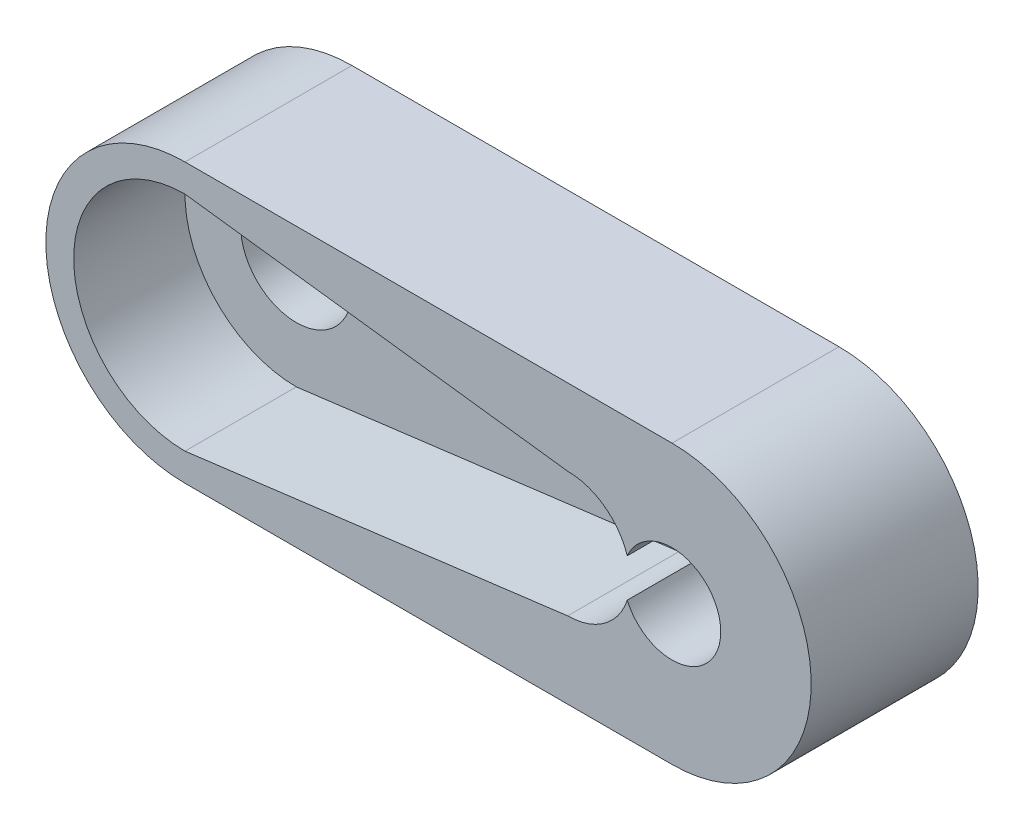
ISO-10303-21;
HEADER;
FILE_DESCRIPTION(('STEP AP214'),'2;1');
FILE_NAME('part.step','',(''),(''),'','','');
FILE_SCHEMA(('AUTOMOTIVE_DESIGN { 1 0 10303 214 1 1 1 1 }'));
ENDSEC;
DATA;
#1=APPLICATION_CONTEXT('core data for automotive mechanical design processes');
#2=APPLICATION_PROTOCOL_DEFINITION('international standard','automotive_design',2000,#1);
#3=PRODUCT_CONTEXT('',#1,'mechanical');
#4=PRODUCT('Part','Part','',(#3));
#5=PRODUCT_RELATED_PRODUCT_CATEGORY('part','',(#4));
#6=PRODUCT_DEFINITION_FORMATION('','',#4);
#7=PRODUCT_DEFINITION_CONTEXT('part definition',#1,'design');
#8=PRODUCT_DEFINITION('design','',#6,#7);
#9=PRODUCT_DEFINITION_SHAPE('','',#8);
#10=(LENGTH_UNIT() NAMED_UNIT(*) SI_UNIT(.MILLI.,.METRE.));
#11=(NAMED_UNIT(*) PLANE_ANGLE_UNIT() SI_UNIT($,.RADIAN.));
#12=(NAMED_UNIT(*) SI_UNIT($,.STERADIAN.) SOLID_ANGLE_UNIT());
#13=UNCERTAINTY_MEASURE_WITH_UNIT(LENGTH_MEASURE(1.E-05),#10,'distance_accuracy_value','');
#14=(GEOMETRIC_REPRESENTATION_CONTEXT(3) GLOBAL_UNCERTAINTY_ASSIGNED_CONTEXT((#13)) GLOBAL_UNIT_ASSIGNED_CONTEXT((#10,
#11,#12)) REPRESENTATION_CONTEXT('',''));
#15=CARTESIAN_POINT('',(0.,0.,0.));
#16=DIRECTION('',(0.,0.,1.));
#17=DIRECTION('',(1.,0.,0.));
#18=AXIS2_PLACEMENT_3D('',#15,#16,#17);
#19=CARTESIAN_POINT('',(0.,5.,6.));
#20=DIRECTION('',(0.,0.,-1.));
#21=DIRECTION('',(-1.,0.,0.));
#22=AXIS2_PLACEMENT_3D('',#19,#20,#21);
#23=CYLINDRICAL_SURFACE('',#22,2.);
#24=CARTESIAN_POINT('',(0.,5.,0.));
#25=DIRECTION('',(0.,0.,1.));
#26=DIRECTION('',(1.,0.,0.));
#27=AXIS2_PLACEMENT_3D('',#24,#25,#26);
#28=CIRCLE('',#27,2.);
#29=CARTESIAN_POINT('',(2.,5.,0.));
#30=VERTEX_POINT('',#29);
#31=EDGE_CURVE('E165',#30,#30,#28,.T.);
#32=ORIENTED_EDGE('',*,*,#31,.F.);
#33=EDGE_LOOP('',(#32));
#34=FACE_BOUND('',#33,.T.);
#35=CARTESIAN_POINT('',(0.,5.,2.));
#36=DIRECTION('',(0.,0.,1.));
#37=DIRECTION('',(1.,0.,0.));
#38=AXIS2_PLACEMENT_3D('',#35,#36,#37);
#39=CIRCLE('',#38,2.);
#40=CARTESIAN_POINT('',(2.,5.,2.));
#41=VERTEX_POINT('',#40);
#42=EDGE_CURVE('E148',#41,#41,#39,.F.);
#43=ORIENTED_EDGE('',*,*,#42,.F.);
#44=EDGE_LOOP('',(#43));
#45=FACE_BOUND('',#44,.T.);
#46=ADVANCED_FACE('F40',(#34,#45),#23,.F.);
#47=CARTESIAN_POINT('',(0.,5.,6.));
#48=DIRECTION('',(0.,0.,1.));
#49=DIRECTION('',(1.,0.,0.));
#50=AXIS2_PLACEMENT_3D('',#47,#48,#49);
#51=PLANE('',#50);
#52=CARTESIAN_POINT('',(13.75,5.,6.));
#53=DIRECTION('',(0.,0.,1.));
#54=DIRECTION('',(1.,0.,0.));
#55=AXIS2_PLACEMENT_3D('',#52,#53,#54);
#56=CIRCLE('',#55,2.25);
#57=CARTESIAN_POINT('',(13.75,2.75,6.));
#58=VERTEX_POINT('',#57);
#59=CARTESIAN_POINT('',(15.8916666666667,4.31024360177749,6.));
#60=VERTEX_POINT('',#59);
#61=EDGE_CURVE('E374',#58,#60,#56,.T.);
#62=ORIENTED_EDGE('',*,*,#61,.F.);
#63=DIRECTION('',(0.991997911723619,0.126254279673915,0.));
#64=VECTOR('',#63,1.);
#65=CARTESIAN_POINT('',(-0.125243981782694,0.984059856864021,6.));
#66=LINE('',#65,#64);
#67=CARTESIAN_POINT('',(0.,1.,6.));
#68=VERTEX_POINT('',#67);
#69=EDGE_CURVE('E370',#68,#58,#66,.T.);
#70=ORIENTED_EDGE('',*,*,#69,.F.);
#71=CARTESIAN_POINT('',(0.,5.,6.));
#72=DIRECTION('',(0.,0.,1.));
#73=DIRECTION('',(1.,0.,0.));
#74=AXIS2_PLACEMENT_3D('',#71,#72,#73);
#75=CIRCLE('',#74,4.);
#76=CARTESIAN_POINT('',(0.,9.,6.));
#77=VERTEX_POINT('',#76);
#78=EDGE_CURVE('E363',#77,#68,#75,.T.);
#79=ORIENTED_EDGE('',*,*,#78,.F.);
#80=DIRECTION('',(0.991997911723619,-0.126254279673915,0.));
#81=VECTOR('',#80,1.);
#82=CARTESIAN_POINT('',(1.12719583604424,8.85653871177619,6.));
#83=LINE('',#82,#81);
#84=CARTESIAN_POINT('',(13.75,7.25,6.));
#85=VERTEX_POINT('',#84);
#86=EDGE_CURVE('E360',#77,#85,#83,.T.);
#87=ORIENTED_EDGE('',*,*,#86,.T.);
#88=CARTESIAN_POINT('',(15.8916666666667,5.68975639822251,6.));
#89=VERTEX_POINT('',#88);
#90=EDGE_CURVE('E364',#89,#85,#56,.T.);
#91=ORIENTED_EDGE('',*,*,#90,.F.);
#92=CARTESIAN_POINT('',(17.5,5.,6.));
#93=DIRECTION('',(0.,0.,1.));
#94=DIRECTION('',(1.,0.,0.));
#95=AXIS2_PLACEMENT_3D('',#92,#93,#94);
#96=CIRCLE('',#95,1.75);
#97=EDGE_CURVE('E153',#60,#89,#96,.T.);
#98=ORIENTED_EDGE('',*,*,#97,.F.);
#99=EDGE_LOOP('',(#62,#70,#79,#87,#91,#98));
#100=FACE_BOUND('',#99,.T.);
#101=CARTESIAN_POINT('',(0.,5.,6.));
#102=DIRECTION('',(0.,0.,1.));
#103=DIRECTION('',(1.,0.,0.));
#104=AXIS2_PLACEMENT_3D('',#101,#102,#103);
#105=CIRCLE('',#104,5.);
#106=CARTESIAN_POINT('',(0.,10.,6.));
#107=VERTEX_POINT('',#106);
#108=CARTESIAN_POINT('',(0.,0.,6.));
#109=VERTEX_POINT('',#108);
#110=EDGE_CURVE('E171',#107,#109,#105,.T.);
#111=ORIENTED_EDGE('',*,*,#110,.T.);
#112=DIRECTION('',(1.,0.,0.));
#113=VECTOR('',#112,1.);
#114=CARTESIAN_POINT('',(0.,0.,6.));
#115=LINE('',#114,#113);
#116=CARTESIAN_POINT('',(17.5,0.,6.));
#117=VERTEX_POINT('',#116);
#118=EDGE_CURVE('E95',#109,#117,#115,.T.);
#119=ORIENTED_EDGE('',*,*,#118,.T.);
#120=CARTESIAN_POINT('',(17.5,5.,6.));
#121=DIRECTION('',(0.,0.,1.));
#122=DIRECTION('',(-1.,0.,0.));
#123=AXIS2_PLACEMENT_3D('',#120,#121,#122);
#124=CIRCLE('',#123,5.);
#125=CARTESIAN_POINT('',(17.5,10.,6.));
#126=VERTEX_POINT('',#125);
#127=EDGE_CURVE('E176',#117,#126,#124,.T.);
#128=ORIENTED_EDGE('',*,*,#127,.T.);
#129=DIRECTION('',(-1.,0.,0.));
#130=VECTOR('',#129,1.);
#131=CARTESIAN_POINT('',(0.,10.,6.));
#132=LINE('',#131,#130);
#133=EDGE_CURVE('E66',#126,#107,#132,.T.);
#134=ORIENTED_EDGE('',*,*,#133,.T.);
#135=EDGE_LOOP('',(#111,#119,#128,#134));
#136=FACE_BOUND('',#135,.T.);
#137=ADVANCED_FACE('F220',(#100,#136),#51,.T.);
#138=CARTESIAN_POINT('',(0.,5.,0.));
#139=DIRECTION('',(0.,0.,1.));
#140=DIRECTION('',(1.,0.,0.));
#141=AXIS2_PLACEMENT_3D('',#138,#139,#140);
#142=PLANE('',#141);
#143=CARTESIAN_POINT('',(17.5,5.,0.));
#144=DIRECTION('',(0.,0.,1.));
#145=DIRECTION('',(1.,0.,0.));
#146=AXIS2_PLACEMENT_3D('',#143,#144,#145);
#147=CIRCLE('',#146,3.00000000000001);
#148=CARTESIAN_POINT('',(14.5,5.,0.));
#149=VERTEX_POINT('',#148);
#150=EDGE_CURVE('E50',#149,#149,#147,.T.);
#151=ORIENTED_EDGE('',*,*,#150,.T.);
#152=EDGE_LOOP('',(#151));
#153=FACE_BOUND('',#152,.T.);
#154=CARTESIAN_POINT('',(0.,5.,0.));
#155=DIRECTION('',(0.,0.,1.));
#156=DIRECTION('',(1.,0.,0.));
#157=AXIS2_PLACEMENT_3D('',#154,#155,#156);
#158=CIRCLE('',#157,5.);
#159=CARTESIAN_POINT('',(0.,10.,0.));
#160=VERTEX_POINT('',#159);
#161=CARTESIAN_POINT('',(0.,0.,0.));
#162=VERTEX_POINT('',#161);
#163=EDGE_CURVE('E170',#160,#162,#158,.T.);
#164=ORIENTED_EDGE('',*,*,#163,.F.);
#165=DIRECTION('',(-1.,0.,0.));
#166=VECTOR('',#165,1.);
#167=CARTESIAN_POINT('',(0.,10.,0.));
#168=LINE('',#167,#166);
#169=CARTESIAN_POINT('',(17.5,10.,0.));
#170=VERTEX_POINT('',#169);
#171=EDGE_CURVE('E87',#170,#160,#168,.T.);
#172=ORIENTED_EDGE('',*,*,#171,.F.);
#173=CARTESIAN_POINT('',(17.5,5.,0.));
#174=DIRECTION('',(0.,0.,1.));
#175=DIRECTION('',(-1.,0.,0.));
#176=AXIS2_PLACEMENT_3D('',#173,#174,#175);
#177=CIRCLE('',#176,5.);
#178=CARTESIAN_POINT('',(17.5,0.,0.));
#179=VERTEX_POINT('',#178);
#180=EDGE_CURVE('E188',#179,#170,#177,.T.);
#181=ORIENTED_EDGE('',*,*,#180,.F.);
#182=DIRECTION('',(1.,0.,0.));
#183=VECTOR('',#182,1.);
#184=CARTESIAN_POINT('',(0.,0.,0.));
#185=LINE('',#184,#183);
#186=EDGE_CURVE('E185',#162,#179,#185,.T.);
#187=ORIENTED_EDGE('',*,*,#186,.F.);
#188=EDGE_LOOP('',(#164,#172,#181,#187));
#189=FACE_BOUND('',#188,.T.);
#190=ORIENTED_EDGE('',*,*,#31,.T.);
#191=EDGE_LOOP('',(#190));
#192=FACE_BOUND('',#191,.T.);
#193=ADVANCED_FACE('F208',(#153,#189,#192),#142,.F.);
#194=CARTESIAN_POINT('',(0.,5.,6.));
#195=DIRECTION('',(0.,0.,-1.));
#196=DIRECTION('',(-1.,0.,0.));
#197=AXIS2_PLACEMENT_3D('',#194,#195,#196);
#198=CYLINDRICAL_SURFACE('',#197,5.);
#199=ORIENTED_EDGE('',*,*,#163,.T.);
#200=DIRECTION('',(0.,0.,-1.));
#201=VECTOR('',#200,1.);
#202=CARTESIAN_POINT('',(0.,0.,6.));
#203=LINE('',#202,#201);
#204=EDGE_CURVE('E202',#109,#162,#203,.T.);
#205=ORIENTED_EDGE('',*,*,#204,.F.);
#206=ORIENTED_EDGE('',*,*,#110,.F.);
#207=DIRECTION('',(0.,0.,-1.));
#208=VECTOR('',#207,1.);
#209=CARTESIAN_POINT('',(0.,10.,6.));
#210=LINE('',#209,#208);
#211=EDGE_CURVE('E181',#107,#160,#210,.T.);
#212=ORIENTED_EDGE('',*,*,#211,.T.);
#213=EDGE_LOOP('',(#199,#205,#206,#212));
#214=FACE_BOUND('',#213,.T.);
#215=ADVANCED_FACE('F235',(#214),#198,.T.);
#216=CARTESIAN_POINT('',(0.,0.,6.));
#217=DIRECTION('',(0.,1.,0.));
#218=DIRECTION('',(0.,0.,1.));
#219=AXIS2_PLACEMENT_3D('',#216,#217,#218);
#220=PLANE('',#219);
#221=ORIENTED_EDGE('',*,*,#186,.T.);
#222=DIRECTION('',(0.,0.,-1.));
#223=VECTOR('',#222,1.);
#224=CARTESIAN_POINT('',(17.5,0.,6.));
#225=LINE('',#224,#223);
#226=EDGE_CURVE('E198',#117,#179,#225,.T.);
#227=ORIENTED_EDGE('',*,*,#226,.F.);
#228=ORIENTED_EDGE('',*,*,#118,.F.);
#229=ORIENTED_EDGE('',*,*,#204,.T.);
#230=EDGE_LOOP('',(#221,#227,#228,#229));
#231=FACE_BOUND('',#230,.T.);
#232=ADVANCED_FACE('F242',(#231),#220,.F.);
#233=CARTESIAN_POINT('',(17.5,5.,6.));
#234=DIRECTION('',(0.,0.,-1.));
#235=DIRECTION('',(-1.,0.,0.));
#236=AXIS2_PLACEMENT_3D('',#233,#234,#235);
#237=CYLINDRICAL_SURFACE('',#236,5.);
#238=ORIENTED_EDGE('',*,*,#180,.T.);
#239=DIRECTION('',(0.,0.,-1.));
#240=VECTOR('',#239,1.);
#241=CARTESIAN_POINT('',(17.5,10.,6.));
#242=LINE('',#241,#240);
#243=EDGE_CURVE('E195',#126,#170,#242,.T.);
#244=ORIENTED_EDGE('',*,*,#243,.F.);
#245=ORIENTED_EDGE('',*,*,#127,.F.);
#246=ORIENTED_EDGE('',*,*,#226,.T.);
#247=EDGE_LOOP('',(#238,#244,#245,#246));
#248=FACE_BOUND('',#247,.T.);
#249=ADVANCED_FACE('F239',(#248),#237,.T.);
#250=CARTESIAN_POINT('',(0.,10.,6.));
#251=DIRECTION('',(0.,-1.,0.));
#252=DIRECTION('',(0.,0.,-1.));
#253=AXIS2_PLACEMENT_3D('',#250,#251,#252);
#254=PLANE('',#253);
#255=ORIENTED_EDGE('',*,*,#171,.T.);
#256=ORIENTED_EDGE('',*,*,#211,.F.);
#257=ORIENTED_EDGE('',*,*,#133,.F.);
#258=ORIENTED_EDGE('',*,*,#243,.T.);
#259=EDGE_LOOP('',(#255,#256,#257,#258));
#260=FACE_BOUND('',#259,.T.);
#261=ADVANCED_FACE('F236',(#260),#254,.F.);
#262=CARTESIAN_POINT('',(17.5,5.,6.));
#263=DIRECTION('',(0.,0.,-1.));
#264=DIRECTION('',(-1.,0.,0.));
#265=AXIS2_PLACEMENT_3D('',#262,#263,#264);
#266=CYLINDRICAL_SURFACE('',#265,1.75);
#267=CARTESIAN_POINT('',(17.5,5.,1.25000000000001));
#268=DIRECTION('',(0.,0.,1.));
#269=DIRECTION('',(1.,0.,0.));
#270=AXIS2_PLACEMENT_3D('',#267,#268,#269);
#271=CIRCLE('',#270,1.75);
#272=CARTESIAN_POINT('',(15.75,5.,1.25000000000001));
#273=VERTEX_POINT('',#272);
#274=EDGE_CURVE('E11',#273,#273,#271,.F.);
#275=ORIENTED_EDGE('',*,*,#274,.T.);
#276=EDGE_LOOP('',(#275));
#277=FACE_BOUND('',#276,.T.);
#278=DIRECTION('',(0.,0.,1.));
#279=VECTOR('',#278,1.);
#280=CARTESIAN_POINT('',(15.8916666666667,4.31024360177749,2.));
#281=LINE('',#280,#279);
#282=CARTESIAN_POINT('',(15.8916666666667,4.31024360177749,2.));
#283=VERTEX_POINT('',#282);
#284=EDGE_CURVE('E166',#283,#60,#281,.T.);
#285=ORIENTED_EDGE('',*,*,#284,.T.);
#286=ORIENTED_EDGE('',*,*,#97,.T.);
#287=DIRECTION('',(0.,0.,1.));
#288=VECTOR('',#287,1.);
#289=CARTESIAN_POINT('',(15.8916666666667,5.68975639822251,2.));
#290=LINE('',#289,#288);
#291=CARTESIAN_POINT('',(15.8916666666667,5.68975639822251,2.));
#292=VERTEX_POINT('',#291);
#293=EDGE_CURVE('E135',#292,#89,#290,.T.);
#294=ORIENTED_EDGE('',*,*,#293,.F.);
#295=CARTESIAN_POINT('',(17.5,5.,2.));
#296=DIRECTION('',(0.,0.,1.));
#297=DIRECTION('',(1.,0.,0.));
#298=AXIS2_PLACEMENT_3D('',#295,#296,#297);
#299=CIRCLE('',#298,1.75);
#300=EDGE_CURVE('E141',#283,#292,#299,.F.);
#301=ORIENTED_EDGE('',*,*,#300,.F.);
#302=EDGE_LOOP('',(#285,#286,#294,#301));
#303=FACE_BOUND('',#302,.T.);
#304=ADVANCED_FACE('F151',(#277,#303),#266,.F.);
#305=CARTESIAN_POINT('',(13.75,5.,2.));
#306=DIRECTION('',(0.,0.,1.));
#307=DIRECTION('',(1.,0.,0.));
#308=AXIS2_PLACEMENT_3D('',#305,#306,#307);
#309=CYLINDRICAL_SURFACE('',#308,2.25);
#310=ORIENTED_EDGE('',*,*,#61,.T.);
#311=ORIENTED_EDGE('',*,*,#284,.F.);
#312=CARTESIAN_POINT('',(13.75,5.,2.));
#313=DIRECTION('',(0.,0.,1.));
#314=DIRECTION('',(1.,0.,0.));
#315=AXIS2_PLACEMENT_3D('',#312,#313,#314);
#316=CIRCLE('',#315,2.25);
#317=CARTESIAN_POINT('',(13.75,2.75,2.));
#318=VERTEX_POINT('',#317);
#319=EDGE_CURVE('E57',#318,#283,#316,.T.);
#320=ORIENTED_EDGE('',*,*,#319,.F.);
#321=DIRECTION('',(0.,0.,1.));
#322=VECTOR('',#321,1.);
#323=CARTESIAN_POINT('',(13.75,2.75,2.));
#324=LINE('',#323,#322);
#325=EDGE_CURVE('E380',#318,#58,#324,.T.);
#326=ORIENTED_EDGE('',*,*,#325,.T.);
#327=EDGE_LOOP('',(#310,#311,#320,#326));
#328=FACE_BOUND('',#327,.T.);
#329=ADVANCED_FACE('F276',(#328),#309,.F.);
#330=CARTESIAN_POINT('',(-0.125243981782694,0.984059856864021,2.));
#331=DIRECTION('',(0.126254279673915,-0.991997911723619,0.));
#332=DIRECTION('',(0.991997911723619,0.126254279673915,0.));
#333=AXIS2_PLACEMENT_3D('',#330,#331,#332);
#334=PLANE('',#333);
#335=ORIENTED_EDGE('',*,*,#69,.T.);
#336=ORIENTED_EDGE('',*,*,#325,.F.);
#337=DIRECTION('',(0.991997911723619,0.126254279673915,0.));
#338=VECTOR('',#337,1.);
#339=CARTESIAN_POINT('',(-0.125243981782694,0.984059856864021,2.));
#340=LINE('',#339,#338);
#341=CARTESIAN_POINT('',(0.,1.,2.));
#342=VERTEX_POINT('',#341);
#343=EDGE_CURVE('E160',#342,#318,#340,.T.);
#344=ORIENTED_EDGE('',*,*,#343,.F.);
#345=DIRECTION('',(0.,0.,1.));
#346=VECTOR('',#345,1.);
#347=CARTESIAN_POINT('',(0.,1.,2.));
#348=LINE('',#347,#346);
#349=EDGE_CURVE('E383',#342,#68,#348,.T.);
#350=ORIENTED_EDGE('',*,*,#349,.T.);
#351=EDGE_LOOP('',(#335,#336,#344,#350));
#352=FACE_BOUND('',#351,.T.);
#353=ADVANCED_FACE('F283',(#352),#334,.F.);
#354=CARTESIAN_POINT('',(0.,5.,2.));
#355=DIRECTION('',(0.,0.,1.));
#356=DIRECTION('',(1.,0.,0.));
#357=AXIS2_PLACEMENT_3D('',#354,#355,#356);
#358=CYLINDRICAL_SURFACE('',#357,4.);
#359=ORIENTED_EDGE('',*,*,#78,.T.);
#360=ORIENTED_EDGE('',*,*,#349,.F.);
#361=CARTESIAN_POINT('',(0.,5.,2.));
#362=DIRECTION('',(0.,0.,1.));
#363=DIRECTION('',(1.,0.,0.));
#364=AXIS2_PLACEMENT_3D('',#361,#362,#363);
#365=CIRCLE('',#364,4.);
#366=CARTESIAN_POINT('',(0.,9.,2.));
#367=VERTEX_POINT('',#366);
#368=EDGE_CURVE('E388',#367,#342,#365,.T.);
#369=ORIENTED_EDGE('',*,*,#368,.F.);
#370=DIRECTION('',(0.,0.,1.));
#371=VECTOR('',#370,1.);
#372=CARTESIAN_POINT('',(0.,9.,2.));
#373=LINE('',#372,#371);
#374=EDGE_CURVE('E158',#367,#77,#373,.T.);
#375=ORIENTED_EDGE('',*,*,#374,.T.);
#376=EDGE_LOOP('',(#359,#360,#369,#375));
#377=FACE_BOUND('',#376,.T.);
#378=ADVANCED_FACE('F292',(#377),#358,.F.);
#379=CARTESIAN_POINT('',(1.12719583604424,8.85653871177619,2.));
#380=DIRECTION('',(-0.126254279673915,-0.991997911723619,0.));
#381=DIRECTION('',(0.991997911723619,-0.126254279673915,0.));
#382=AXIS2_PLACEMENT_3D('',#379,#380,#381);
#383=PLANE('',#382);
#384=ORIENTED_EDGE('',*,*,#86,.F.);
#385=ORIENTED_EDGE('',*,*,#374,.F.);
#386=DIRECTION('',(0.991997911723619,-0.126254279673915,0.));
#387=VECTOR('',#386,1.);
#388=CARTESIAN_POINT('',(1.12719583604424,8.85653871177619,2.));
#389=LINE('',#388,#387);
#390=CARTESIAN_POINT('',(13.75,7.25,2.));
#391=VERTEX_POINT('',#390);
#392=EDGE_CURVE('E140',#367,#391,#389,.T.);
#393=ORIENTED_EDGE('',*,*,#392,.T.);
#394=DIRECTION('',(0.,0.,1.));
#395=VECTOR('',#394,1.);
#396=CARTESIAN_POINT('',(13.75,7.25,2.));
#397=LINE('',#396,#395);
#398=EDGE_CURVE('E137',#391,#85,#397,.T.);
#399=ORIENTED_EDGE('',*,*,#398,.T.);
#400=EDGE_LOOP('',(#384,#385,#393,#399));
#401=FACE_BOUND('',#400,.T.);
#402=ADVANCED_FACE('F300',(#401),#383,.T.);
#403=ORIENTED_EDGE('',*,*,#90,.T.);
#404=ORIENTED_EDGE('',*,*,#398,.F.);
#405=EDGE_CURVE('E131',#292,#391,#316,.T.);
#406=ORIENTED_EDGE('',*,*,#405,.F.);
#407=ORIENTED_EDGE('',*,*,#293,.T.);
#408=EDGE_LOOP('',(#403,#404,#406,#407));
#409=FACE_BOUND('',#408,.T.);
#410=ADVANCED_FACE('F133',(#409),#309,.F.);
#411=CARTESIAN_POINT('',(0.,0.,2.));
#412=DIRECTION('',(0.,0.,1.));
#413=DIRECTION('',(1.,0.,0.));
#414=AXIS2_PLACEMENT_3D('',#411,#412,#413);
#415=PLANE('',#414);
#416=ORIENTED_EDGE('',*,*,#42,.T.);
#417=EDGE_LOOP('',(#416));
#418=FACE_BOUND('',#417,.T.);
#419=ORIENTED_EDGE('',*,*,#300,.T.);
#420=ORIENTED_EDGE('',*,*,#405,.T.);
#421=ORIENTED_EDGE('',*,*,#392,.F.);
#422=ORIENTED_EDGE('',*,*,#368,.T.);
#423=ORIENTED_EDGE('',*,*,#343,.T.);
#424=ORIENTED_EDGE('',*,*,#319,.T.);
#425=EDGE_LOOP('',(#419,#420,#421,#422,#423,#424));
#426=FACE_BOUND('',#425,.T.);
#427=ADVANCED_FACE('F144',(#418,#426),#415,.T.);
#428=CARTESIAN_POINT('',(17.5,5.,0.));
#429=DIRECTION('',(0.,0.,-1.));
#430=DIRECTION('',(-1.,0.,0.));
#431=AXIS2_PLACEMENT_3D('',#428,#429,#430);
#432=CONICAL_SURFACE('',#431,3.00000000000001,0.785398163397446);
#433=CARTESIAN_POINT('',(15.75,5.,1.25000000000001));
#434=CARTESIAN_POINT('',(15.7369791666667,5.,1.23697916666668));
#435=CARTESIAN_POINT('',(15.7239583333333,5.,1.22395833333335));
#436=CARTESIAN_POINT('',(15.6979166666667,5.,1.19791666666668));
#437=CARTESIAN_POINT('',(15.6848958333333,5.,1.18489583333335));
#438=CARTESIAN_POINT('',(15.6588541666667,5.,1.15885416666668));
#439=CARTESIAN_POINT('',(15.6458333333333,5.,1.14583333333334));
#440=CARTESIAN_POINT('',(15.6197916666667,5.,1.11979166666668));
#441=CARTESIAN_POINT('',(15.6067708333333,5.,1.10677083333335));
#442=CARTESIAN_POINT('',(15.5807291666667,5.,1.08072916666668));
#443=CARTESIAN_POINT('',(15.5677083333333,5.,1.06770833333334));
#444=CARTESIAN_POINT('',(15.5416666666667,5.,1.04166666666668));
#445=CARTESIAN_POINT('',(15.5286458333333,5.,1.02864583333334));
#446=CARTESIAN_POINT('',(15.5026041666667,5.,1.00260416666668));
#447=CARTESIAN_POINT('',(15.4895833333333,5.,0.989583333333344));
#448=CARTESIAN_POINT('',(15.4635416666667,5.,0.963541666666677));
#449=CARTESIAN_POINT('',(15.4505208333333,5.,0.950520833333343));
#450=CARTESIAN_POINT('',(15.4244791666667,5.,0.924479166666676));
#451=CARTESIAN_POINT('',(15.4114583333333,5.,0.911458333333343));
#452=CARTESIAN_POINT('',(15.3854166666667,5.,0.885416666666676));
#453=CARTESIAN_POINT('',(15.3723958333333,5.,0.872395833333343));
#454=CARTESIAN_POINT('',(15.3463541666667,5.,0.846354166666676));
#455=CARTESIAN_POINT('',(15.3333333333333,5.,0.833333333333342));
#456=CARTESIAN_POINT('',(15.3072916666667,5.,0.807291666666675));
#457=CARTESIAN_POINT('',(15.2942708333333,5.,0.794270833333341));
#458=CARTESIAN_POINT('',(15.2682291666667,5.,0.768229166666675));
#459=CARTESIAN_POINT('',(15.2552083333333,5.,0.755208333333341));
#460=CARTESIAN_POINT('',(15.2291666666667,5.,0.729166666666674));
#461=CARTESIAN_POINT('',(15.2161458333333,5.,0.716145833333341));
#462=CARTESIAN_POINT('',(15.1901041666667,5.,0.690104166666674));
#463=CARTESIAN_POINT('',(15.1770833333333,5.,0.67708333333334));
#464=CARTESIAN_POINT('',(15.1510416666667,5.,0.651041666666673));
#465=CARTESIAN_POINT('',(15.1380208333333,5.,0.63802083333334));
#466=CARTESIAN_POINT('',(15.1119791666667,5.,0.611979166666673));
#467=CARTESIAN_POINT('',(15.0989583333333,5.,0.59895833333334));
#468=CARTESIAN_POINT('',(15.0729166666667,5.,0.572916666666673));
#469=CARTESIAN_POINT('',(15.0598958333333,5.,0.559895833333339));
#470=CARTESIAN_POINT('',(15.0338541666667,5.,0.533854166666672));
#471=CARTESIAN_POINT('',(15.0208333333333,5.,0.520833333333339));
#472=CARTESIAN_POINT('',(14.9947916666667,5.,0.494791666666672));
#473=CARTESIAN_POINT('',(14.9817708333333,5.,0.481770833333339));
#474=CARTESIAN_POINT('',(14.9557291666667,5.,0.455729166666672));
#475=CARTESIAN_POINT('',(14.9427083333333,5.,0.442708333333338));
#476=CARTESIAN_POINT('',(14.9166666666667,5.,0.416666666666671));
#477=CARTESIAN_POINT('',(14.9036458333333,5.,0.403645833333337));
#478=CARTESIAN_POINT('',(14.8776041666667,5.,0.377604166666671));
#479=CARTESIAN_POINT('',(14.8645833333333,5.,0.364583333333337));
#480=CARTESIAN_POINT('',(14.8385416666667,5.,0.33854166666667));
#481=CARTESIAN_POINT('',(14.8255208333333,5.,0.325520833333337));
#482=CARTESIAN_POINT('',(14.7994791666667,5.,0.29947916666667));
#483=CARTESIAN_POINT('',(14.7864583333333,5.,0.286458333333336));
#484=CARTESIAN_POINT('',(14.7604166666667,5.,0.260416666666669));
#485=CARTESIAN_POINT('',(14.7473958333333,5.,0.247395833333336));
#486=CARTESIAN_POINT('',(14.7213541666667,5.,0.221354166666669));
#487=CARTESIAN_POINT('',(14.7083333333333,5.,0.208333333333336));
#488=CARTESIAN_POINT('',(14.6822916666667,5.,0.182291666666669));
#489=CARTESIAN_POINT('',(14.6692708333333,5.,0.169270833333335));
#490=CARTESIAN_POINT('',(14.6432291666667,5.,0.143229166666668));
#491=CARTESIAN_POINT('',(14.6302083333333,5.,0.130208333333335));
#492=CARTESIAN_POINT('',(14.6041666666667,5.,0.104166666666668));
#493=CARTESIAN_POINT('',(14.5911458333333,5.,0.0911458333333345));
#494=CARTESIAN_POINT('',(14.5651041666667,5.,0.0651041666666676));
#495=CARTESIAN_POINT('',(14.5520833333333,5.,0.052083333333334));
#496=CARTESIAN_POINT('',(14.5260416666667,5.,0.0260416666666667));
#497=CARTESIAN_POINT('',(14.5130208333333,5.,0.013020833333333));
#498=CARTESIAN_POINT('',(14.5,5.,0.));
#499=B_SPLINE_CURVE_WITH_KNOTS('',3,(#433,#434,#435,#436,#437,#438,#439,#440,#441,#442,#443,
#444,#445,#446,#447,#448,#449,#450,#451,#452,#453,#454,#455,#456,#457,#458,#459,#460,#461,#462,
#463,#464,#465,#466,#467,#468,#469,#470,#471,#472,#473,#474,#475,#476,#477,#478,#479,#480,#481,
#482,#483,#484,#485,#486,#487,#488,#489,#490,#491,#492,#493,#494,#495,#496,#497,#498),
.UNSPECIFIED.,.F.,.F.,(4,2,2,2,2,2,2,2,2,2,2,2,2,2,2,2,2,2,2,2,2,2,2,2,2,2,2,2,2,2,2,2,4),(0.,
0.0552427172801988,0.110485434560398,0.165728151840596,0.220970869120797,0.276213586400996,
0.331456303681196,0.386699020961396,0.441941738241595,0.497184455521795,0.552427172801995,
0.607669890082193,0.662912607362392,0.718155324642592,0.773398041922792,0.828640759202991,
0.883883476483191,0.939126193763391,0.99436891104359,1.04961162832379,1.10485434560399,
1.16009706288419,1.21533978016439,1.27058249744459,1.32582521472479,1.38106793200499,
1.43631064928519,1.49155336656539,1.54679608384558,1.60203880112578,1.65728151840598,
1.71252423568618,1.76776695296638),.UNSPECIFIED.);
#500=EDGE_CURVE('BSEAM43',#273,#149,#499,.T.);
#501=ORIENTED_EDGE('',*,*,#274,.F.);
#502=ORIENTED_EDGE('',*,*,#150,.F.);
#503=ORIENTED_EDGE('',*,*,#500,.T.);
#504=ORIENTED_EDGE('',*,*,#500,.F.);
#505=EDGE_LOOP('',(#501,#503,#502,#504));
#506=FACE_BOUND('',#505,.T.);
#507=ADVANCED_FACE('F43',(#506),#432,.F.);
#508=CLOSED_SHELL('',(#46,#137,#193,#215,#232,#249,#261,#304,#329,#353,#378,#402,#410,#427,#507));
#509=MANIFOLD_SOLID_BREP('B2',#508);
#510=ADVANCED_BREP_SHAPE_REPRESENTATION('',(#18,#509),#14);
#511=SHAPE_DEFINITION_REPRESENTATION(#9,#510);
ENDSEC;
END-ISO-10303-21;
